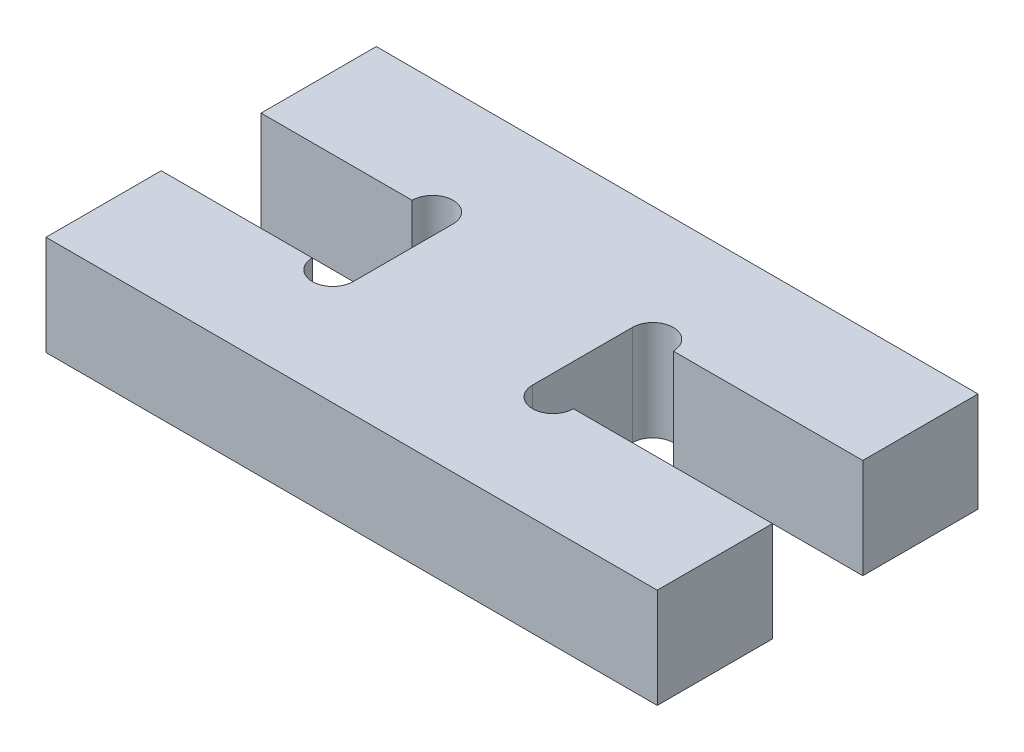
ISO-10303-21;
HEADER;
FILE_DESCRIPTION(('STEP AP214'),'2;1');
FILE_NAME('part.step','',(''),(''),'','','');
FILE_SCHEMA(('AUTOMOTIVE_DESIGN { 1 0 10303 214 1 1 1 1 }'));
ENDSEC;
DATA;
#1=APPLICATION_CONTEXT('core data for automotive mechanical design processes');
#2=APPLICATION_PROTOCOL_DEFINITION('international standard','automotive_design',2000,#1);
#3=PRODUCT_CONTEXT('',#1,'mechanical');
#4=PRODUCT('Part','Part','',(#3));
#5=PRODUCT_RELATED_PRODUCT_CATEGORY('part','',(#4));
#6=PRODUCT_DEFINITION_FORMATION('','',#4);
#7=PRODUCT_DEFINITION_CONTEXT('part definition',#1,'design');
#8=PRODUCT_DEFINITION('design','',#6,#7);
#9=PRODUCT_DEFINITION_SHAPE('','',#8);
#10=(LENGTH_UNIT() NAMED_UNIT(*) SI_UNIT(.MILLI.,.METRE.));
#11=(NAMED_UNIT(*) PLANE_ANGLE_UNIT() SI_UNIT($,.RADIAN.));
#12=(NAMED_UNIT(*) SI_UNIT($,.STERADIAN.) SOLID_ANGLE_UNIT());
#13=UNCERTAINTY_MEASURE_WITH_UNIT(LENGTH_MEASURE(1.E-05),#10,'distance_accuracy_value','');
#14=(GEOMETRIC_REPRESENTATION_CONTEXT(3) GLOBAL_UNCERTAINTY_ASSIGNED_CONTEXT((#13)) GLOBAL_UNIT_ASSIGNED_CONTEXT((#10,
#11,#12)) REPRESENTATION_CONTEXT('',''));
#15=CARTESIAN_POINT('',(0.,0.,0.));
#16=DIRECTION('',(0.,0.,1.));
#17=DIRECTION('',(1.,0.,0.));
#18=AXIS2_PLACEMENT_3D('',#15,#16,#17);
#19=CARTESIAN_POINT('',(13.4,7.8,-9.));
#20=DIRECTION('',(0.,-1.,0.));
#21=DIRECTION('',(0.,0.,-1.));
#22=AXIS2_PLACEMENT_3D('',#19,#20,#21);
#23=CYLINDRICAL_SURFACE('',#22,1.6);
#24=CARTESIAN_POINT('',(13.4,0.,-9.));
#25=DIRECTION('',(0.,1.,0.));
#26=DIRECTION('',(0.,0.,1.));
#27=AXIS2_PLACEMENT_3D('',#24,#25,#26);
#28=CIRCLE('',#27,1.6);
#29=CARTESIAN_POINT('',(11.8,0.,-9.));
#30=VERTEX_POINT('',#29);
#31=CARTESIAN_POINT('',(15.,0.,-9.));
#32=VERTEX_POINT('',#31);
#33=EDGE_CURVE('E176',#30,#32,#28,.T.);
#34=ORIENTED_EDGE('',*,*,#33,.F.);
#35=DIRECTION('',(0.,-1.,0.));
#36=VECTOR('',#35,1.);
#37=CARTESIAN_POINT('',(11.8,7.8,-9.));
#38=LINE('',#37,#36);
#39=CARTESIAN_POINT('',(11.8,7.8,-9.));
#40=VERTEX_POINT('',#39);
#41=EDGE_CURVE('E11',#40,#30,#38,.T.);
#42=ORIENTED_EDGE('',*,*,#41,.F.);
#43=CARTESIAN_POINT('',(13.4,7.8,-9.));
#44=DIRECTION('',(0.,1.,0.));
#45=DIRECTION('',(0.,0.,1.));
#46=AXIS2_PLACEMENT_3D('',#43,#44,#45);
#47=CIRCLE('',#46,1.6);
#48=CARTESIAN_POINT('',(15.,7.8,-9.));
#49=VERTEX_POINT('',#48);
#50=EDGE_CURVE('E220',#40,#49,#47,.T.);
#51=ORIENTED_EDGE('',*,*,#50,.T.);
#52=DIRECTION('',(0.,-1.,0.));
#53=VECTOR('',#52,1.);
#54=CARTESIAN_POINT('',(15.,7.8,-9.));
#55=LINE('',#54,#53);
#56=EDGE_CURVE('E51',#49,#32,#55,.T.);
#57=ORIENTED_EDGE('',*,*,#56,.T.);
#58=EDGE_LOOP('',(#34,#42,#51,#57));
#59=FACE_BOUND('',#58,.T.);
#60=ADVANCED_FACE('F35',(#59),#23,.F.);
#61=CARTESIAN_POINT('',(0.,7.8,-9.));
#62=DIRECTION('',(0.,0.,-1.));
#63=DIRECTION('',(-1.,0.,0.));
#64=AXIS2_PLACEMENT_3D('',#61,#62,#63);
#65=PLANE('',#64);
#66=DIRECTION('',(1.,0.,0.));
#67=VECTOR('',#66,1.);
#68=CARTESIAN_POINT('',(0.,0.,-9.));
#69=LINE('',#68,#67);
#70=CARTESIAN_POINT('',(0.,0.,-9.));
#71=VERTEX_POINT('',#70);
#72=EDGE_CURVE('E178',#71,#30,#69,.T.);
#73=ORIENTED_EDGE('',*,*,#72,.F.);
#74=DIRECTION('',(0.,-1.,0.));
#75=VECTOR('',#74,1.);
#76=CARTESIAN_POINT('',(0.,7.8,-9.));
#77=LINE('',#76,#75);
#78=CARTESIAN_POINT('',(0.,7.8,-9.));
#79=VERTEX_POINT('',#78);
#80=EDGE_CURVE('E43',#79,#71,#77,.T.);
#81=ORIENTED_EDGE('',*,*,#80,.F.);
#82=DIRECTION('',(1.,0.,0.));
#83=VECTOR('',#82,1.);
#84=CARTESIAN_POINT('',(0.,7.8,-9.));
#85=LINE('',#84,#83);
#86=EDGE_CURVE('E265',#79,#40,#85,.T.);
#87=ORIENTED_EDGE('',*,*,#86,.T.);
#88=ORIENTED_EDGE('',*,*,#41,.T.);
#89=EDGE_LOOP('',(#73,#81,#87,#88));
#90=FACE_BOUND('',#89,.T.);
#91=ADVANCED_FACE('F253',(#90),#65,.T.);
#92=CARTESIAN_POINT('',(0.,7.8,0.));
#93=DIRECTION('',(-1.,0.,0.));
#94=DIRECTION('',(0.,0.,1.));
#95=AXIS2_PLACEMENT_3D('',#92,#93,#94);
#96=PLANE('',#95);
#97=DIRECTION('',(0.,0.,-1.));
#98=VECTOR('',#97,1.);
#99=CARTESIAN_POINT('',(0.,0.,0.));
#100=LINE('',#99,#98);
#101=CARTESIAN_POINT('',(0.,0.,0.));
#102=VERTEX_POINT('',#101);
#103=EDGE_CURVE('E181',#102,#71,#100,.T.);
#104=ORIENTED_EDGE('',*,*,#103,.F.);
#105=DIRECTION('',(0.,-1.,0.));
#106=VECTOR('',#105,1.);
#107=CARTESIAN_POINT('',(0.,7.8,0.));
#108=LINE('',#107,#106);
#109=CARTESIAN_POINT('',(0.,7.8,0.));
#110=VERTEX_POINT('',#109);
#111=EDGE_CURVE('E242',#110,#102,#108,.T.);
#112=ORIENTED_EDGE('',*,*,#111,.F.);
#113=DIRECTION('',(0.,0.,-1.));
#114=VECTOR('',#113,1.);
#115=CARTESIAN_POINT('',(0.,7.8,0.));
#116=LINE('',#115,#114);
#117=EDGE_CURVE('E249',#110,#79,#116,.T.);
#118=ORIENTED_EDGE('',*,*,#117,.T.);
#119=ORIENTED_EDGE('',*,*,#80,.T.);
#120=EDGE_LOOP('',(#104,#112,#118,#119));
#121=FACE_BOUND('',#120,.T.);
#122=ADVANCED_FACE('F247',(#121),#96,.T.);
#123=CARTESIAN_POINT('',(0.,7.8,0.));
#124=DIRECTION('',(0.,0.,1.));
#125=DIRECTION('',(1.,0.,0.));
#126=AXIS2_PLACEMENT_3D('',#123,#124,#125);
#127=PLANE('',#126);
#128=DIRECTION('',(-1.,0.,0.));
#129=VECTOR('',#128,1.);
#130=CARTESIAN_POINT('',(0.,0.,0.));
#131=LINE('',#130,#129);
#132=CARTESIAN_POINT('',(47.7473684210526,0.,0.));
#133=VERTEX_POINT('',#132);
#134=EDGE_CURVE('E184',#133,#102,#131,.T.);
#135=ORIENTED_EDGE('',*,*,#134,.F.);
#136=DIRECTION('',(0.,-1.,0.));
#137=VECTOR('',#136,1.);
#138=CARTESIAN_POINT('',(47.7473684210526,7.8,0.));
#139=LINE('',#138,#137);
#140=CARTESIAN_POINT('',(47.7473684210526,7.8,0.));
#141=VERTEX_POINT('',#140);
#142=EDGE_CURVE('E240',#141,#133,#139,.T.);
#143=ORIENTED_EDGE('',*,*,#142,.F.);
#144=DIRECTION('',(-1.,0.,0.));
#145=VECTOR('',#144,1.);
#146=CARTESIAN_POINT('',(0.,7.8,0.));
#147=LINE('',#146,#145);
#148=EDGE_CURVE('E262',#141,#110,#147,.T.);
#149=ORIENTED_EDGE('',*,*,#148,.T.);
#150=ORIENTED_EDGE('',*,*,#111,.T.);
#151=EDGE_LOOP('',(#135,#143,#149,#150));
#152=FACE_BOUND('',#151,.T.);
#153=ADVANCED_FACE('F259',(#152),#127,.T.);
#154=CARTESIAN_POINT('',(47.7473684210526,7.8,0.));
#155=DIRECTION('',(1.,0.,0.));
#156=DIRECTION('',(0.,0.,-1.));
#157=AXIS2_PLACEMENT_3D('',#154,#155,#156);
#158=PLANE('',#157);
#159=DIRECTION('',(0.,0.,1.));
#160=VECTOR('',#159,1.);
#161=CARTESIAN_POINT('',(47.7473684210526,0.,0.));
#162=LINE('',#161,#160);
#163=CARTESIAN_POINT('',(47.7473684210526,0.,-9.));
#164=VERTEX_POINT('',#163);
#165=EDGE_CURVE('E187',#164,#133,#162,.T.);
#166=ORIENTED_EDGE('',*,*,#165,.F.);
#167=DIRECTION('',(0.,-1.,0.));
#168=VECTOR('',#167,1.);
#169=CARTESIAN_POINT('',(47.7473684210526,7.8,-9.));
#170=LINE('',#169,#168);
#171=CARTESIAN_POINT('',(47.7473684210526,7.8,-9.));
#172=VERTEX_POINT('',#171);
#173=EDGE_CURVE('E238',#172,#164,#170,.T.);
#174=ORIENTED_EDGE('',*,*,#173,.F.);
#175=DIRECTION('',(0.,0.,1.));
#176=VECTOR('',#175,1.);
#177=CARTESIAN_POINT('',(47.7473684210526,7.8,0.));
#178=LINE('',#177,#176);
#179=EDGE_CURVE('E267',#172,#141,#178,.T.);
#180=ORIENTED_EDGE('',*,*,#179,.T.);
#181=ORIENTED_EDGE('',*,*,#142,.T.);
#182=EDGE_LOOP('',(#166,#174,#180,#181));
#183=FACE_BOUND('',#182,.T.);
#184=ADVANCED_FACE('F318',(#183),#158,.T.);
#185=CARTESIAN_POINT('',(0.,7.8,-9.));
#186=DIRECTION('',(0.,0.,-1.));
#187=DIRECTION('',(-1.,0.,0.));
#188=AXIS2_PLACEMENT_3D('',#185,#186,#187);
#189=PLANE('',#188);
#190=DIRECTION('',(1.,0.,0.));
#191=VECTOR('',#190,1.);
#192=CARTESIAN_POINT('',(0.,0.,-9.));
#193=LINE('',#192,#191);
#194=CARTESIAN_POINT('',(32.2,0.,-9.));
#195=VERTEX_POINT('',#194);
#196=EDGE_CURVE('E190',#195,#164,#193,.T.);
#197=ORIENTED_EDGE('',*,*,#196,.F.);
#198=DIRECTION('',(0.,-1.,0.));
#199=VECTOR('',#198,1.);
#200=CARTESIAN_POINT('',(32.2,7.8,-9.));
#201=LINE('',#200,#199);
#202=CARTESIAN_POINT('',(32.2,7.8,-9.));
#203=VERTEX_POINT('',#202);
#204=EDGE_CURVE('E236',#203,#195,#201,.T.);
#205=ORIENTED_EDGE('',*,*,#204,.F.);
#206=DIRECTION('',(1.,0.,0.));
#207=VECTOR('',#206,1.);
#208=CARTESIAN_POINT('',(0.,7.8,-9.));
#209=LINE('',#208,#207);
#210=EDGE_CURVE('E273',#203,#172,#209,.T.);
#211=ORIENTED_EDGE('',*,*,#210,.T.);
#212=ORIENTED_EDGE('',*,*,#173,.T.);
#213=EDGE_LOOP('',(#197,#205,#211,#212));
#214=FACE_BOUND('',#213,.T.);
#215=ADVANCED_FACE('F321',(#214),#189,.T.);
#216=CARTESIAN_POINT('',(30.6,7.8,-9.));
#217=DIRECTION('',(0.,-1.,0.));
#218=DIRECTION('',(0.,0.,-1.));
#219=AXIS2_PLACEMENT_3D('',#216,#217,#218);
#220=CYLINDRICAL_SURFACE('',#219,1.6);
#221=CARTESIAN_POINT('',(30.6,0.,-9.));
#222=DIRECTION('',(0.,1.,0.));
#223=DIRECTION('',(0.,0.,1.));
#224=AXIS2_PLACEMENT_3D('',#221,#222,#223);
#225=CIRCLE('',#224,1.6);
#226=CARTESIAN_POINT('',(29.,0.,-9.));
#227=VERTEX_POINT('',#226);
#228=EDGE_CURVE('E193',#227,#195,#225,.T.);
#229=ORIENTED_EDGE('',*,*,#228,.F.);
#230=DIRECTION('',(0.,-1.,0.));
#231=VECTOR('',#230,1.);
#232=CARTESIAN_POINT('',(29.,7.8,-9.));
#233=LINE('',#232,#231);
#234=CARTESIAN_POINT('',(29.,7.8,-9.));
#235=VERTEX_POINT('',#234);
#236=EDGE_CURVE('E234',#235,#227,#233,.T.);
#237=ORIENTED_EDGE('',*,*,#236,.F.);
#238=CARTESIAN_POINT('',(30.6,7.8,-9.));
#239=DIRECTION('',(0.,1.,0.));
#240=DIRECTION('',(0.,0.,1.));
#241=AXIS2_PLACEMENT_3D('',#238,#239,#240);
#242=CIRCLE('',#241,1.6);
#243=EDGE_CURVE('E276',#235,#203,#242,.T.);
#244=ORIENTED_EDGE('',*,*,#243,.T.);
#245=ORIENTED_EDGE('',*,*,#204,.T.);
#246=EDGE_LOOP('',(#229,#237,#244,#245));
#247=FACE_BOUND('',#246,.T.);
#248=ADVANCED_FACE('F325',(#247),#220,.F.);
#249=CARTESIAN_POINT('',(29.,7.8,0.));
#250=DIRECTION('',(1.,0.,0.));
#251=DIRECTION('',(0.,0.,-1.));
#252=AXIS2_PLACEMENT_3D('',#249,#250,#251);
#253=PLANE('',#252);
#254=DIRECTION('',(0.,0.,1.));
#255=VECTOR('',#254,1.);
#256=CARTESIAN_POINT('',(29.,0.,0.));
#257=LINE('',#256,#255);
#258=CARTESIAN_POINT('',(29.,0.,-16.8));
#259=VERTEX_POINT('',#258);
#260=EDGE_CURVE('E196',#259,#227,#257,.T.);
#261=ORIENTED_EDGE('',*,*,#260,.F.);
#262=DIRECTION('',(0.,-1.,0.));
#263=VECTOR('',#262,1.);
#264=CARTESIAN_POINT('',(29.,7.8,-16.8));
#265=LINE('',#264,#263);
#266=CARTESIAN_POINT('',(29.,7.8,-16.8));
#267=VERTEX_POINT('',#266);
#268=EDGE_CURVE('E232',#267,#259,#265,.T.);
#269=ORIENTED_EDGE('',*,*,#268,.F.);
#270=DIRECTION('',(0.,0.,1.));
#271=VECTOR('',#270,1.);
#272=CARTESIAN_POINT('',(29.,7.8,0.));
#273=LINE('',#272,#271);
#274=EDGE_CURVE('E279',#267,#235,#273,.T.);
#275=ORIENTED_EDGE('',*,*,#274,.T.);
#276=ORIENTED_EDGE('',*,*,#236,.T.);
#277=EDGE_LOOP('',(#261,#269,#275,#276));
#278=FACE_BOUND('',#277,.T.);
#279=ADVANCED_FACE('F329',(#278),#253,.T.);
#280=CARTESIAN_POINT('',(30.6,7.8,-16.8));
#281=DIRECTION('',(0.,-1.,0.));
#282=DIRECTION('',(0.,0.,-1.));
#283=AXIS2_PLACEMENT_3D('',#280,#281,#282);
#284=CYLINDRICAL_SURFACE('',#283,1.6);
#285=CARTESIAN_POINT('',(30.6,0.,-16.8));
#286=DIRECTION('',(0.,1.,0.));
#287=DIRECTION('',(0.,0.,1.));
#288=AXIS2_PLACEMENT_3D('',#285,#286,#287);
#289=CIRCLE('',#288,1.6);
#290=CARTESIAN_POINT('',(32.2,0.,-16.8));
#291=VERTEX_POINT('',#290);
#292=EDGE_CURVE('E199',#291,#259,#289,.T.);
#293=ORIENTED_EDGE('',*,*,#292,.F.);
#294=DIRECTION('',(0.,-1.,0.));
#295=VECTOR('',#294,1.);
#296=CARTESIAN_POINT('',(32.2,7.8,-16.8));
#297=LINE('',#296,#295);
#298=CARTESIAN_POINT('',(32.2,7.8,-16.8));
#299=VERTEX_POINT('',#298);
#300=EDGE_CURVE('E230',#299,#291,#297,.T.);
#301=ORIENTED_EDGE('',*,*,#300,.F.);
#302=CARTESIAN_POINT('',(30.6,7.8,-16.8));
#303=DIRECTION('',(0.,1.,0.));
#304=DIRECTION('',(0.,0.,1.));
#305=AXIS2_PLACEMENT_3D('',#302,#303,#304);
#306=CIRCLE('',#305,1.6);
#307=EDGE_CURVE('E282',#299,#267,#306,.T.);
#308=ORIENTED_EDGE('',*,*,#307,.T.);
#309=ORIENTED_EDGE('',*,*,#268,.T.);
#310=EDGE_LOOP('',(#293,#301,#308,#309));
#311=FACE_BOUND('',#310,.T.);
#312=ADVANCED_FACE('F333',(#311),#284,.F.);
#313=CARTESIAN_POINT('',(0.,7.8,-16.8));
#314=DIRECTION('',(0.,0.,1.));
#315=DIRECTION('',(1.,0.,0.));
#316=AXIS2_PLACEMENT_3D('',#313,#314,#315);
#317=PLANE('',#316);
#318=DIRECTION('',(-1.,0.,0.));
#319=VECTOR('',#318,1.);
#320=CARTESIAN_POINT('',(0.,0.,-16.8));
#321=LINE('',#320,#319);
#322=CARTESIAN_POINT('',(47.,0.,-16.8));
#323=VERTEX_POINT('',#322);
#324=EDGE_CURVE('E202',#323,#291,#321,.T.);
#325=ORIENTED_EDGE('',*,*,#324,.F.);
#326=DIRECTION('',(0.,-1.,0.));
#327=VECTOR('',#326,1.);
#328=CARTESIAN_POINT('',(47.,7.8,-16.8));
#329=LINE('',#328,#327);
#330=CARTESIAN_POINT('',(47.,7.8,-16.8));
#331=VERTEX_POINT('',#330);
#332=EDGE_CURVE('E228',#331,#323,#329,.T.);
#333=ORIENTED_EDGE('',*,*,#332,.F.);
#334=DIRECTION('',(-1.,0.,0.));
#335=VECTOR('',#334,1.);
#336=CARTESIAN_POINT('',(0.,7.8,-16.8));
#337=LINE('',#336,#335);
#338=EDGE_CURVE('E285',#331,#299,#337,.T.);
#339=ORIENTED_EDGE('',*,*,#338,.T.);
#340=ORIENTED_EDGE('',*,*,#300,.T.);
#341=EDGE_LOOP('',(#325,#333,#339,#340));
#342=FACE_BOUND('',#341,.T.);
#343=ADVANCED_FACE('F337',(#342),#317,.T.);
#344=CARTESIAN_POINT('',(47.,7.8,0.));
#345=DIRECTION('',(1.,0.,0.));
#346=DIRECTION('',(0.,0.,-1.));
#347=AXIS2_PLACEMENT_3D('',#344,#345,#346);
#348=PLANE('',#347);
#349=DIRECTION('',(0.,0.,1.));
#350=VECTOR('',#349,1.);
#351=CARTESIAN_POINT('',(47.,0.,0.));
#352=LINE('',#351,#350);
#353=CARTESIAN_POINT('',(47.,0.,-25.8));
#354=VERTEX_POINT('',#353);
#355=EDGE_CURVE('E205',#354,#323,#352,.T.);
#356=ORIENTED_EDGE('',*,*,#355,.F.);
#357=DIRECTION('',(0.,-1.,0.));
#358=VECTOR('',#357,1.);
#359=CARTESIAN_POINT('',(47.,7.8,-25.8));
#360=LINE('',#359,#358);
#361=CARTESIAN_POINT('',(47.,7.8,-25.8));
#362=VERTEX_POINT('',#361);
#363=EDGE_CURVE('E226',#362,#354,#360,.T.);
#364=ORIENTED_EDGE('',*,*,#363,.F.);
#365=DIRECTION('',(0.,0.,1.));
#366=VECTOR('',#365,1.);
#367=CARTESIAN_POINT('',(47.,7.8,0.));
#368=LINE('',#367,#366);
#369=EDGE_CURVE('E288',#362,#331,#368,.T.);
#370=ORIENTED_EDGE('',*,*,#369,.T.);
#371=ORIENTED_EDGE('',*,*,#332,.T.);
#372=EDGE_LOOP('',(#356,#364,#370,#371));
#373=FACE_BOUND('',#372,.T.);
#374=ADVANCED_FACE('F341',(#373),#348,.T.);
#375=CARTESIAN_POINT('',(0.,7.8,-25.8));
#376=DIRECTION('',(0.,0.,-1.));
#377=DIRECTION('',(-1.,0.,0.));
#378=AXIS2_PLACEMENT_3D('',#375,#376,#377);
#379=PLANE('',#378);
#380=DIRECTION('',(1.,0.,0.));
#381=VECTOR('',#380,1.);
#382=CARTESIAN_POINT('',(0.,0.,-25.8));
#383=LINE('',#382,#381);
#384=CARTESIAN_POINT('',(0.,0.,-25.8));
#385=VERTEX_POINT('',#384);
#386=EDGE_CURVE('E208',#385,#354,#383,.T.);
#387=ORIENTED_EDGE('',*,*,#386,.F.);
#388=DIRECTION('',(0.,-1.,0.));
#389=VECTOR('',#388,1.);
#390=CARTESIAN_POINT('',(0.,7.8,-25.8));
#391=LINE('',#390,#389);
#392=CARTESIAN_POINT('',(0.,7.8,-25.8));
#393=VERTEX_POINT('',#392);
#394=EDGE_CURVE('E224',#393,#385,#391,.T.);
#395=ORIENTED_EDGE('',*,*,#394,.F.);
#396=DIRECTION('',(1.,0.,0.));
#397=VECTOR('',#396,1.);
#398=CARTESIAN_POINT('',(0.,7.8,-25.8));
#399=LINE('',#398,#397);
#400=EDGE_CURVE('E291',#393,#362,#399,.T.);
#401=ORIENTED_EDGE('',*,*,#400,.T.);
#402=ORIENTED_EDGE('',*,*,#363,.T.);
#403=EDGE_LOOP('',(#387,#395,#401,#402));
#404=FACE_BOUND('',#403,.T.);
#405=ADVANCED_FACE('F345',(#404),#379,.T.);
#406=CARTESIAN_POINT('',(0.,7.8,0.));
#407=DIRECTION('',(-1.,0.,0.));
#408=DIRECTION('',(0.,0.,1.));
#409=AXIS2_PLACEMENT_3D('',#406,#407,#408);
#410=PLANE('',#409);
#411=DIRECTION('',(0.,0.,-1.));
#412=VECTOR('',#411,1.);
#413=CARTESIAN_POINT('',(0.,0.,0.));
#414=LINE('',#413,#412);
#415=CARTESIAN_POINT('',(0.,0.,-16.8));
#416=VERTEX_POINT('',#415);
#417=EDGE_CURVE('E211',#416,#385,#414,.T.);
#418=ORIENTED_EDGE('',*,*,#417,.F.);
#419=DIRECTION('',(0.,-1.,0.));
#420=VECTOR('',#419,1.);
#421=CARTESIAN_POINT('',(0.,7.8,-16.8));
#422=LINE('',#421,#420);
#423=CARTESIAN_POINT('',(0.,7.8,-16.8));
#424=VERTEX_POINT('',#423);
#425=EDGE_CURVE('E158',#424,#416,#422,.T.);
#426=ORIENTED_EDGE('',*,*,#425,.F.);
#427=DIRECTION('',(0.,0.,-1.));
#428=VECTOR('',#427,1.);
#429=CARTESIAN_POINT('',(0.,7.8,0.));
#430=LINE('',#429,#428);
#431=EDGE_CURVE('E168',#424,#393,#430,.T.);
#432=ORIENTED_EDGE('',*,*,#431,.T.);
#433=ORIENTED_EDGE('',*,*,#394,.T.);
#434=EDGE_LOOP('',(#418,#426,#432,#433));
#435=FACE_BOUND('',#434,.T.);
#436=ADVANCED_FACE('F295',(#435),#410,.T.);
#437=CARTESIAN_POINT('',(0.,7.8,-16.8));
#438=DIRECTION('',(0.,0.,1.));
#439=DIRECTION('',(1.,0.,0.));
#440=AXIS2_PLACEMENT_3D('',#437,#438,#439);
#441=PLANE('',#440);
#442=DIRECTION('',(-1.,0.,0.));
#443=VECTOR('',#442,1.);
#444=CARTESIAN_POINT('',(0.,0.,-16.8));
#445=LINE('',#444,#443);
#446=CARTESIAN_POINT('',(11.8,0.,-16.8));
#447=VERTEX_POINT('',#446);
#448=EDGE_CURVE('E154',#447,#416,#445,.T.);
#449=ORIENTED_EDGE('',*,*,#448,.F.);
#450=DIRECTION('',(0.,-1.,0.));
#451=VECTOR('',#450,1.);
#452=CARTESIAN_POINT('',(11.8,7.8,-16.8));
#453=LINE('',#452,#451);
#454=CARTESIAN_POINT('',(11.8,7.8,-16.8));
#455=VERTEX_POINT('',#454);
#456=EDGE_CURVE('E149',#455,#447,#453,.T.);
#457=ORIENTED_EDGE('',*,*,#456,.F.);
#458=DIRECTION('',(-1.,0.,0.));
#459=VECTOR('',#458,1.);
#460=CARTESIAN_POINT('',(0.,7.8,-16.8));
#461=LINE('',#460,#459);
#462=EDGE_CURVE('E152',#455,#424,#461,.T.);
#463=ORIENTED_EDGE('',*,*,#462,.T.);
#464=ORIENTED_EDGE('',*,*,#425,.T.);
#465=EDGE_LOOP('',(#449,#457,#463,#464));
#466=FACE_BOUND('',#465,.T.);
#467=ADVANCED_FACE('F151',(#466),#441,.T.);
#468=CARTESIAN_POINT('',(13.4,7.8,-16.8));
#469=DIRECTION('',(0.,-1.,0.));
#470=DIRECTION('',(0.,0.,-1.));
#471=AXIS2_PLACEMENT_3D('',#468,#469,#470);
#472=CYLINDRICAL_SURFACE('',#471,1.6);
#473=CARTESIAN_POINT('',(13.4,0.,-16.8));
#474=DIRECTION('',(0.,1.,0.));
#475=DIRECTION('',(0.,0.,1.));
#476=AXIS2_PLACEMENT_3D('',#473,#474,#475);
#477=CIRCLE('',#476,1.6);
#478=CARTESIAN_POINT('',(15.,0.,-16.8));
#479=VERTEX_POINT('',#478);
#480=EDGE_CURVE('E215',#479,#447,#477,.T.);
#481=ORIENTED_EDGE('',*,*,#480,.F.);
#482=DIRECTION('',(0.,-1.,0.));
#483=VECTOR('',#482,1.);
#484=CARTESIAN_POINT('',(15.,7.8,-16.8));
#485=LINE('',#484,#483);
#486=CARTESIAN_POINT('',(15.,7.8,-16.8));
#487=VERTEX_POINT('',#486);
#488=EDGE_CURVE('E100',#487,#479,#485,.T.);
#489=ORIENTED_EDGE('',*,*,#488,.F.);
#490=CARTESIAN_POINT('',(13.4,7.8,-16.8));
#491=DIRECTION('',(0.,1.,0.));
#492=DIRECTION('',(0.,0.,1.));
#493=AXIS2_PLACEMENT_3D('',#490,#491,#492);
#494=CIRCLE('',#493,1.6);
#495=EDGE_CURVE('E165',#487,#455,#494,.T.);
#496=ORIENTED_EDGE('',*,*,#495,.T.);
#497=ORIENTED_EDGE('',*,*,#456,.T.);
#498=EDGE_LOOP('',(#481,#489,#496,#497));
#499=FACE_BOUND('',#498,.T.);
#500=ADVANCED_FACE('F170',(#499),#472,.F.);
#501=CARTESIAN_POINT('',(15.,7.8,0.));
#502=DIRECTION('',(-1.,0.,0.));
#503=DIRECTION('',(0.,0.,1.));
#504=AXIS2_PLACEMENT_3D('',#501,#502,#503);
#505=PLANE('',#504);
#506=DIRECTION('',(0.,0.,-1.));
#507=VECTOR('',#506,1.);
#508=CARTESIAN_POINT('',(15.,0.,0.));
#509=LINE('',#508,#507);
#510=EDGE_CURVE('E217',#32,#479,#509,.T.);
#511=ORIENTED_EDGE('',*,*,#510,.F.);
#512=ORIENTED_EDGE('',*,*,#56,.F.);
#513=DIRECTION('',(0.,0.,-1.));
#514=VECTOR('',#513,1.);
#515=CARTESIAN_POINT('',(15.,7.8,0.));
#516=LINE('',#515,#514);
#517=EDGE_CURVE('E171',#49,#487,#516,.T.);
#518=ORIENTED_EDGE('',*,*,#517,.T.);
#519=ORIENTED_EDGE('',*,*,#488,.T.);
#520=EDGE_LOOP('',(#511,#512,#518,#519));
#521=FACE_BOUND('',#520,.T.);
#522=ADVANCED_FACE('F297',(#521),#505,.T.);
#523=CARTESIAN_POINT('',(0.,7.8,0.));
#524=DIRECTION('',(0.,1.,0.));
#525=DIRECTION('',(0.,0.,1.));
#526=AXIS2_PLACEMENT_3D('',#523,#524,#525);
#527=PLANE('',#526);
#528=ORIENTED_EDGE('',*,*,#50,.F.);
#529=ORIENTED_EDGE('',*,*,#86,.F.);
#530=ORIENTED_EDGE('',*,*,#117,.F.);
#531=ORIENTED_EDGE('',*,*,#148,.F.);
#532=ORIENTED_EDGE('',*,*,#179,.F.);
#533=ORIENTED_EDGE('',*,*,#210,.F.);
#534=ORIENTED_EDGE('',*,*,#243,.F.);
#535=ORIENTED_EDGE('',*,*,#274,.F.);
#536=ORIENTED_EDGE('',*,*,#307,.F.);
#537=ORIENTED_EDGE('',*,*,#338,.F.);
#538=ORIENTED_EDGE('',*,*,#369,.F.);
#539=ORIENTED_EDGE('',*,*,#400,.F.);
#540=ORIENTED_EDGE('',*,*,#431,.F.);
#541=ORIENTED_EDGE('',*,*,#462,.F.);
#542=ORIENTED_EDGE('',*,*,#495,.F.);
#543=ORIENTED_EDGE('',*,*,#517,.F.);
#544=EDGE_LOOP('',(#528,#529,#530,#531,#532,#533,#534,#535,#536,#537,#538,#539,#540,#541,#542,#543));
#545=FACE_BOUND('',#544,.T.);
#546=ADVANCED_FACE('F163',(#545),#527,.T.);
#547=CARTESIAN_POINT('',(0.,0.,0.));
#548=DIRECTION('',(0.,1.,0.));
#549=DIRECTION('',(0.,0.,1.));
#550=AXIS2_PLACEMENT_3D('',#547,#548,#549);
#551=PLANE('',#550);
#552=ORIENTED_EDGE('',*,*,#33,.T.);
#553=ORIENTED_EDGE('',*,*,#510,.T.);
#554=ORIENTED_EDGE('',*,*,#480,.T.);
#555=ORIENTED_EDGE('',*,*,#448,.T.);
#556=ORIENTED_EDGE('',*,*,#417,.T.);
#557=ORIENTED_EDGE('',*,*,#386,.T.);
#558=ORIENTED_EDGE('',*,*,#355,.T.);
#559=ORIENTED_EDGE('',*,*,#324,.T.);
#560=ORIENTED_EDGE('',*,*,#292,.T.);
#561=ORIENTED_EDGE('',*,*,#260,.T.);
#562=ORIENTED_EDGE('',*,*,#228,.T.);
#563=ORIENTED_EDGE('',*,*,#196,.T.);
#564=ORIENTED_EDGE('',*,*,#165,.T.);
#565=ORIENTED_EDGE('',*,*,#134,.T.);
#566=ORIENTED_EDGE('',*,*,#103,.T.);
#567=ORIENTED_EDGE('',*,*,#72,.T.);
#568=EDGE_LOOP('',(#552,#553,#554,#555,#556,#557,#558,#559,#560,#561,#562,#563,#564,#565,#566,#567));
#569=FACE_BOUND('',#568,.T.);
#570=ADVANCED_FACE('F255',(#569),#551,.F.);
#571=CLOSED_SHELL('',(#60,#91,#122,#153,#184,#215,#248,#279,#312,#343,#374,#405,#436,#467,#500,
#522,#546,#570));
#572=MANIFOLD_SOLID_BREP('B2',#571);
#573=ADVANCED_BREP_SHAPE_REPRESENTATION('',(#18,#572),#14);
#574=SHAPE_DEFINITION_REPRESENTATION(#9,#573);
ENDSEC;
END-ISO-10303-21;
